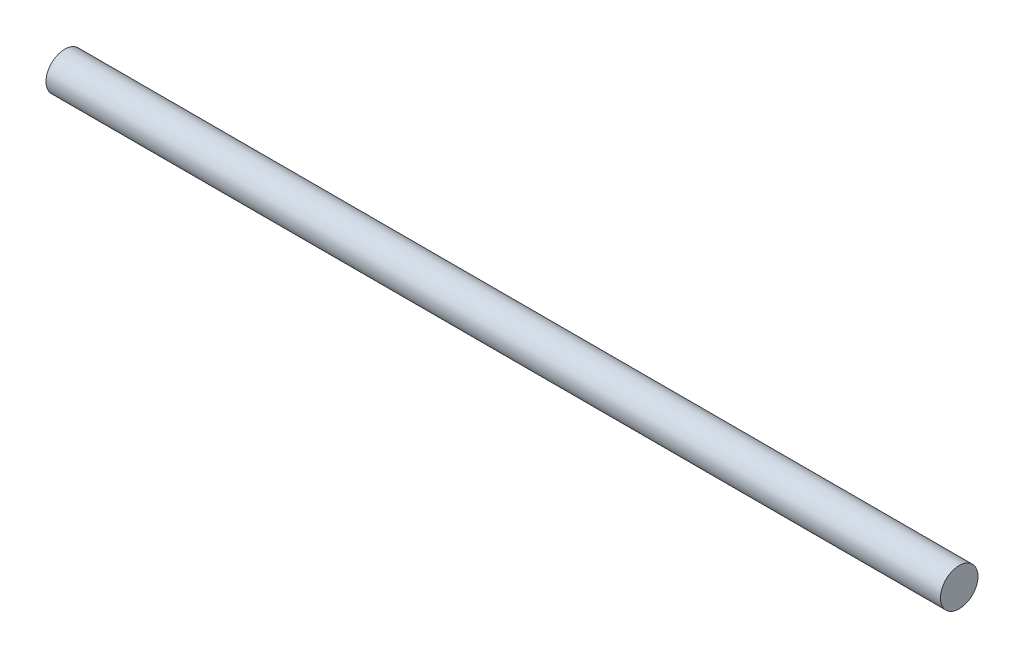
ISO-10303-21;
HEADER;
FILE_DESCRIPTION(('STEP AP214'),'2;1');
FILE_NAME('part.step','',(''),(''),'','','');
FILE_SCHEMA(('AUTOMOTIVE_DESIGN { 1 0 10303 214 1 1 1 1 }'));
ENDSEC;
DATA;
#1=APPLICATION_CONTEXT('core data for automotive mechanical design processes');
#2=APPLICATION_PROTOCOL_DEFINITION('international standard','automotive_design',2000,#1);
#3=PRODUCT_CONTEXT('',#1,'mechanical');
#4=PRODUCT('Part','Part','',(#3));
#5=PRODUCT_RELATED_PRODUCT_CATEGORY('part','',(#4));
#6=PRODUCT_DEFINITION_FORMATION('','',#4);
#7=PRODUCT_DEFINITION_CONTEXT('part definition',#1,'design');
#8=PRODUCT_DEFINITION('design','',#6,#7);
#9=PRODUCT_DEFINITION_SHAPE('','',#8);
#10=(LENGTH_UNIT() NAMED_UNIT(*) SI_UNIT(.MILLI.,.METRE.));
#11=(NAMED_UNIT(*) PLANE_ANGLE_UNIT() SI_UNIT($,.RADIAN.));
#12=(NAMED_UNIT(*) SI_UNIT($,.STERADIAN.) SOLID_ANGLE_UNIT());
#13=UNCERTAINTY_MEASURE_WITH_UNIT(LENGTH_MEASURE(1.E-05),#10,'distance_accuracy_value','');
#14=(GEOMETRIC_REPRESENTATION_CONTEXT(3) GLOBAL_UNCERTAINTY_ASSIGNED_CONTEXT((#13)) GLOBAL_UNIT_ASSIGNED_CONTEXT((#10,
#11,#12)) REPRESENTATION_CONTEXT('',''));
#15=CARTESIAN_POINT('',(0.,0.,0.));
#16=DIRECTION('',(0.,0.,1.));
#17=DIRECTION('',(1.,0.,0.));
#18=AXIS2_PLACEMENT_3D('',#15,#16,#17);
#19=CARTESIAN_POINT('',(590.,0.,0.));
#20=DIRECTION('',(-1.,0.,0.));
#21=DIRECTION('',(0.,0.,1.));
#22=AXIS2_PLACEMENT_3D('',#19,#20,#21);
#23=CYLINDRICAL_SURFACE('',#22,10.);
#24=CARTESIAN_POINT('',(590.,0.,0.));
#25=DIRECTION('',(1.,0.,0.));
#26=DIRECTION('',(0.,0.,-1.));
#27=AXIS2_PLACEMENT_3D('',#24,#25,#26);
#28=CIRCLE('',#27,10.);
#29=CARTESIAN_POINT('',(590.,0.,-10.));
#30=VERTEX_POINT('',#29);
#31=EDGE_CURVE('E10',#30,#30,#28,.T.);
#32=ORIENTED_EDGE('',*,*,#31,.F.);
#33=EDGE_LOOP('',(#32));
#34=FACE_BOUND('',#33,.T.);
#35=CARTESIAN_POINT('',(114.,0.,0.));
#36=DIRECTION('',(-1.,0.,0.));
#37=DIRECTION('',(0.,0.,1.));
#38=AXIS2_PLACEMENT_3D('',#35,#36,#37);
#39=CIRCLE('',#38,10.);
#40=CARTESIAN_POINT('',(114.,0.,10.));
#41=VERTEX_POINT('',#40);
#42=EDGE_CURVE('E33',#41,#41,#39,.T.);
#43=ORIENTED_EDGE('',*,*,#42,.F.);
#44=EDGE_LOOP('',(#43));
#45=FACE_BOUND('',#44,.T.);
#46=ADVANCED_FACE('F30',(#34,#45),#23,.T.);
#47=CARTESIAN_POINT('',(590.,0.,0.));
#48=DIRECTION('',(1.,0.,0.));
#49=DIRECTION('',(0.,0.,-1.));
#50=AXIS2_PLACEMENT_3D('',#47,#48,#49);
#51=PLANE('',#50);
#52=ORIENTED_EDGE('',*,*,#31,.T.);
#53=EDGE_LOOP('',(#52));
#54=FACE_BOUND('',#53,.T.);
#55=ADVANCED_FACE('F45',(#54),#51,.T.);
#56=CARTESIAN_POINT('',(114.,0.,0.));
#57=DIRECTION('',(-1.,0.,0.));
#58=DIRECTION('',(0.,0.,1.));
#59=AXIS2_PLACEMENT_3D('',#56,#57,#58);
#60=PLANE('',#59);
#61=ORIENTED_EDGE('',*,*,#42,.T.);
#62=EDGE_LOOP('',(#61));
#63=FACE_BOUND('',#62,.T.);
#64=ADVANCED_FACE('F42',(#63),#60,.T.);
#65=CLOSED_SHELL('',(#46,#55,#64));
#66=MANIFOLD_SOLID_BREP('B2',#65);
#67=ADVANCED_BREP_SHAPE_REPRESENTATION('',(#18,#66),#14);
#68=SHAPE_DEFINITION_REPRESENTATION(#9,#67);
ENDSEC;
END-ISO-10303-21;
